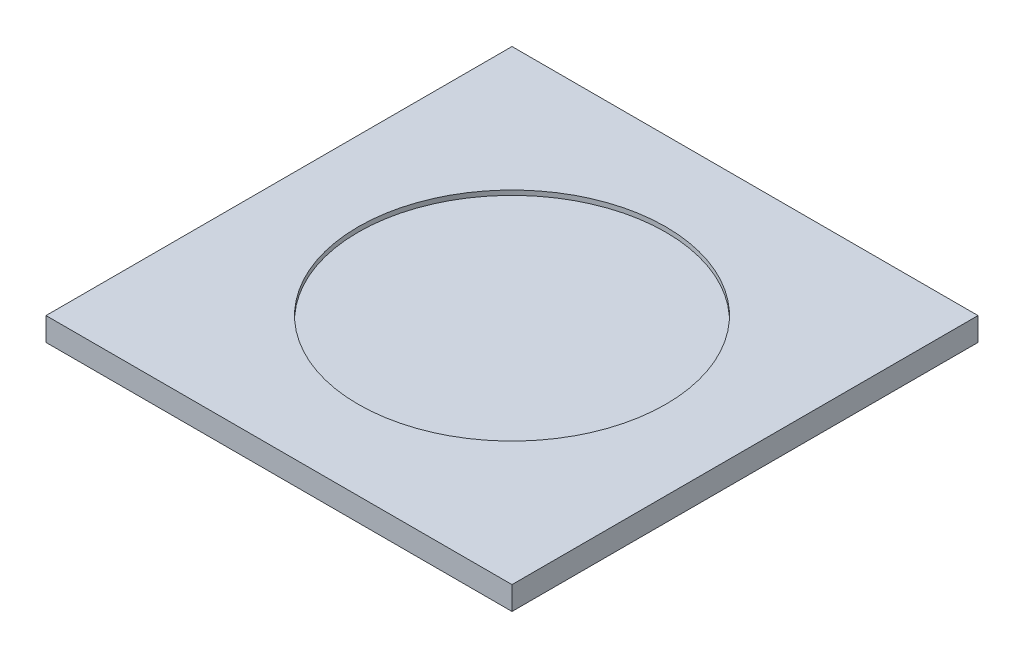
ISO-10303-21;
HEADER;
FILE_DESCRIPTION(('STEP AP214'),'2;1');
FILE_NAME('part.step','',(''),(''),'','','');
FILE_SCHEMA(('AUTOMOTIVE_DESIGN { 1 0 10303 214 1 1 1 1 }'));
ENDSEC;
DATA;
#1=APPLICATION_CONTEXT('core data for automotive mechanical design processes');
#2=APPLICATION_PROTOCOL_DEFINITION('international standard','automotive_design',2000,#1);
#3=PRODUCT_CONTEXT('',#1,'mechanical');
#4=PRODUCT('Part','Part','',(#3));
#5=PRODUCT_RELATED_PRODUCT_CATEGORY('part','',(#4));
#6=PRODUCT_DEFINITION_FORMATION('','',#4);
#7=PRODUCT_DEFINITION_CONTEXT('part definition',#1,'design');
#8=PRODUCT_DEFINITION('design','',#6,#7);
#9=PRODUCT_DEFINITION_SHAPE('','',#8);
#10=(LENGTH_UNIT() NAMED_UNIT(*) SI_UNIT(.MILLI.,.METRE.));
#11=(NAMED_UNIT(*) PLANE_ANGLE_UNIT() SI_UNIT($,.RADIAN.));
#12=(NAMED_UNIT(*) SI_UNIT($,.STERADIAN.) SOLID_ANGLE_UNIT());
#13=UNCERTAINTY_MEASURE_WITH_UNIT(LENGTH_MEASURE(1.E-05),#10,'distance_accuracy_value','');
#14=(GEOMETRIC_REPRESENTATION_CONTEXT(3) GLOBAL_UNCERTAINTY_ASSIGNED_CONTEXT((#13)) GLOBAL_UNIT_ASSIGNED_CONTEXT((#10,
#11,#12)) REPRESENTATION_CONTEXT('',''));
#15=CARTESIAN_POINT('',(0.,0.,0.));
#16=DIRECTION('',(0.,0.,1.));
#17=DIRECTION('',(1.,0.,0.));
#18=AXIS2_PLACEMENT_3D('',#15,#16,#17);
#19=CARTESIAN_POINT('',(1000.,100.,1000.));
#20=DIRECTION('',(-1.,0.,0.));
#21=DIRECTION('',(0.,0.,1.));
#22=AXIS2_PLACEMENT_3D('',#19,#20,#21);
#23=PLANE('',#22);
#24=DIRECTION('',(0.,0.,-1.));
#25=VECTOR('',#24,1.);
#26=CARTESIAN_POINT('',(1000.,0.,1000.));
#27=LINE('',#26,#25);
#28=CARTESIAN_POINT('',(1000.,0.,1000.));
#29=VERTEX_POINT('',#28);
#30=CARTESIAN_POINT('',(1000.,0.,-1000.));
#31=VERTEX_POINT('',#30);
#32=EDGE_CURVE('E107',#29,#31,#27,.T.);
#33=ORIENTED_EDGE('',*,*,#32,.T.);
#34=DIRECTION('',(0.,-1.,0.));
#35=VECTOR('',#34,1.);
#36=CARTESIAN_POINT('',(1000.,100.,-1000.));
#37=LINE('',#36,#35);
#38=CARTESIAN_POINT('',(1000.,100.,-1000.));
#39=VERTEX_POINT('',#38);
#40=EDGE_CURVE('E11',#39,#31,#37,.T.);
#41=ORIENTED_EDGE('',*,*,#40,.F.);
#42=DIRECTION('',(0.,0.,-1.));
#43=VECTOR('',#42,1.);
#44=CARTESIAN_POINT('',(1000.,100.,1000.));
#45=LINE('',#44,#43);
#46=CARTESIAN_POINT('',(1000.,100.,1000.));
#47=VERTEX_POINT('',#46);
#48=EDGE_CURVE('E91',#47,#39,#45,.T.);
#49=ORIENTED_EDGE('',*,*,#48,.F.);
#50=DIRECTION('',(0.,-1.,0.));
#51=VECTOR('',#50,1.);
#52=CARTESIAN_POINT('',(1000.,100.,1000.));
#53=LINE('',#52,#51);
#54=EDGE_CURVE('E103',#47,#29,#53,.T.);
#55=ORIENTED_EDGE('',*,*,#54,.T.);
#56=EDGE_LOOP('',(#33,#41,#49,#55));
#57=FACE_BOUND('',#56,.T.);
#58=ADVANCED_FACE('F39',(#57),#23,.F.);
#59=CARTESIAN_POINT('',(-1000.,100.,-1000.));
#60=DIRECTION('',(0.,0.,1.));
#61=DIRECTION('',(1.,0.,0.));
#62=AXIS2_PLACEMENT_3D('',#59,#60,#61);
#63=PLANE('',#62);
#64=DIRECTION('',(-1.,0.,0.));
#65=VECTOR('',#64,1.);
#66=CARTESIAN_POINT('',(-1000.,0.,-1000.));
#67=LINE('',#66,#65);
#68=CARTESIAN_POINT('',(-1000.,0.,-1000.));
#69=VERTEX_POINT('',#68);
#70=EDGE_CURVE('E96',#31,#69,#67,.T.);
#71=ORIENTED_EDGE('',*,*,#70,.T.);
#72=DIRECTION('',(0.,-1.,0.));
#73=VECTOR('',#72,1.);
#74=CARTESIAN_POINT('',(-1000.,100.,-1000.));
#75=LINE('',#74,#73);
#76=CARTESIAN_POINT('',(-1000.,100.,-1000.));
#77=VERTEX_POINT('',#76);
#78=EDGE_CURVE('E48',#77,#69,#75,.T.);
#79=ORIENTED_EDGE('',*,*,#78,.F.);
#80=DIRECTION('',(-1.,0.,0.));
#81=VECTOR('',#80,1.);
#82=CARTESIAN_POINT('',(-1000.,100.,-1000.));
#83=LINE('',#82,#81);
#84=EDGE_CURVE('E86',#39,#77,#83,.T.);
#85=ORIENTED_EDGE('',*,*,#84,.F.);
#86=ORIENTED_EDGE('',*,*,#40,.T.);
#87=EDGE_LOOP('',(#71,#79,#85,#86));
#88=FACE_BOUND('',#87,.T.);
#89=ADVANCED_FACE('F95',(#88),#63,.F.);
#90=CARTESIAN_POINT('',(-1000.,100.,1000.));
#91=DIRECTION('',(1.,0.,0.));
#92=DIRECTION('',(0.,0.,-1.));
#93=AXIS2_PLACEMENT_3D('',#90,#91,#92);
#94=PLANE('',#93);
#95=DIRECTION('',(0.,0.,1.));
#96=VECTOR('',#95,1.);
#97=CARTESIAN_POINT('',(-1000.,0.,1000.));
#98=LINE('',#97,#96);
#99=CARTESIAN_POINT('',(-1000.,0.,1000.));
#100=VERTEX_POINT('',#99);
#101=EDGE_CURVE('E73',#69,#100,#98,.T.);
#102=ORIENTED_EDGE('',*,*,#101,.T.);
#103=DIRECTION('',(0.,-1.,0.));
#104=VECTOR('',#103,1.);
#105=CARTESIAN_POINT('',(-1000.,100.,1000.));
#106=LINE('',#105,#104);
#107=CARTESIAN_POINT('',(-1000.,100.,1000.));
#108=VERTEX_POINT('',#107);
#109=EDGE_CURVE('E98',#108,#100,#106,.T.);
#110=ORIENTED_EDGE('',*,*,#109,.F.);
#111=DIRECTION('',(0.,0.,1.));
#112=VECTOR('',#111,1.);
#113=CARTESIAN_POINT('',(-1000.,100.,1000.));
#114=LINE('',#113,#112);
#115=EDGE_CURVE('E89',#77,#108,#114,.T.);
#116=ORIENTED_EDGE('',*,*,#115,.F.);
#117=ORIENTED_EDGE('',*,*,#78,.T.);
#118=EDGE_LOOP('',(#102,#110,#116,#117));
#119=FACE_BOUND('',#118,.T.);
#120=ADVANCED_FACE('F99',(#119),#94,.F.);
#121=CARTESIAN_POINT('',(-1000.,100.,1000.));
#122=DIRECTION('',(0.,0.,-1.));
#123=DIRECTION('',(-1.,0.,0.));
#124=AXIS2_PLACEMENT_3D('',#121,#122,#123);
#125=PLANE('',#124);
#126=DIRECTION('',(1.,0.,0.));
#127=VECTOR('',#126,1.);
#128=CARTESIAN_POINT('',(-1000.,0.,1000.));
#129=LINE('',#128,#127);
#130=EDGE_CURVE('E79',#100,#29,#129,.T.);
#131=ORIENTED_EDGE('',*,*,#130,.T.);
#132=ORIENTED_EDGE('',*,*,#54,.F.);
#133=DIRECTION('',(1.,0.,0.));
#134=VECTOR('',#133,1.);
#135=CARTESIAN_POINT('',(-1000.,100.,1000.));
#136=LINE('',#135,#134);
#137=EDGE_CURVE('E56',#108,#47,#136,.T.);
#138=ORIENTED_EDGE('',*,*,#137,.F.);
#139=ORIENTED_EDGE('',*,*,#109,.T.);
#140=EDGE_LOOP('',(#131,#132,#138,#139));
#141=FACE_BOUND('',#140,.T.);
#142=ADVANCED_FACE('F121',(#141),#125,.F.);
#143=CARTESIAN_POINT('',(0.,100.,0.));
#144=DIRECTION('',(0.,-1.,0.));
#145=DIRECTION('',(0.,0.,-1.));
#146=AXIS2_PLACEMENT_3D('',#143,#144,#145);
#147=PLANE('',#146);
#148=CARTESIAN_POINT('',(0.,100.,0.));
#149=DIRECTION('',(0.,1.,0.));
#150=DIRECTION('',(0.,0.,1.));
#151=AXIS2_PLACEMENT_3D('',#148,#149,#150);
#152=CIRCLE('',#151,660.);
#153=CARTESIAN_POINT('',(0.,100.,660.));
#154=VERTEX_POINT('',#153);
#155=EDGE_CURVE('E128',#154,#154,#152,.T.);
#156=ORIENTED_EDGE('',*,*,#155,.F.);
#157=EDGE_LOOP('',(#156));
#158=FACE_BOUND('',#157,.T.);
#159=ORIENTED_EDGE('',*,*,#48,.T.);
#160=ORIENTED_EDGE('',*,*,#84,.T.);
#161=ORIENTED_EDGE('',*,*,#115,.T.);
#162=ORIENTED_EDGE('',*,*,#137,.T.);
#163=EDGE_LOOP('',(#159,#160,#161,#162));
#164=FACE_BOUND('',#163,.T.);
#165=ADVANCED_FACE('F87',(#158,#164),#147,.F.);
#166=CARTESIAN_POINT('',(0.,0.,0.));
#167=DIRECTION('',(0.,-1.,0.));
#168=DIRECTION('',(0.,0.,-1.));
#169=AXIS2_PLACEMENT_3D('',#166,#167,#168);
#170=PLANE('',#169);
#171=ORIENTED_EDGE('',*,*,#32,.F.);
#172=ORIENTED_EDGE('',*,*,#130,.F.);
#173=ORIENTED_EDGE('',*,*,#101,.F.);
#174=ORIENTED_EDGE('',*,*,#70,.F.);
#175=EDGE_LOOP('',(#171,#172,#173,#174));
#176=FACE_BOUND('',#175,.T.);
#177=ADVANCED_FACE('F124',(#176),#170,.T.);
#178=CARTESIAN_POINT('',(0.,80.,0.));
#179=DIRECTION('',(0.,1.,0.));
#180=DIRECTION('',(0.,0.,1.));
#181=AXIS2_PLACEMENT_3D('',#178,#179,#180);
#182=CYLINDRICAL_SURFACE('',#181,660.);
#183=CARTESIAN_POINT('',(0.,80.,0.));
#184=DIRECTION('',(0.,1.,0.));
#185=DIRECTION('',(0.,0.,1.));
#186=AXIS2_PLACEMENT_3D('',#183,#184,#185);
#187=CIRCLE('',#186,660.);
#188=CARTESIAN_POINT('',(0.,80.,660.));
#189=VERTEX_POINT('',#188);
#190=EDGE_CURVE('E111',#189,#189,#187,.T.);
#191=ORIENTED_EDGE('',*,*,#190,.F.);
#192=EDGE_LOOP('',(#191));
#193=FACE_BOUND('',#192,.T.);
#194=ORIENTED_EDGE('',*,*,#155,.T.);
#195=EDGE_LOOP('',(#194));
#196=FACE_BOUND('',#195,.T.);
#197=ADVANCED_FACE('F138',(#193,#196),#182,.F.);
#198=CARTESIAN_POINT('',(0.,80.,0.));
#199=DIRECTION('',(0.,1.,0.));
#200=DIRECTION('',(0.,0.,1.));
#201=AXIS2_PLACEMENT_3D('',#198,#199,#200);
#202=PLANE('',#201);
#203=ORIENTED_EDGE('',*,*,#190,.T.);
#204=EDGE_LOOP('',(#203));
#205=FACE_BOUND('',#204,.T.);
#206=ADVANCED_FACE('F136',(#205),#202,.T.);
#207=CLOSED_SHELL('',(#58,#89,#120,#142,#165,#177,#197,#206));
#208=MANIFOLD_SOLID_BREP('B2',#207);
#209=ADVANCED_BREP_SHAPE_REPRESENTATION('',(#18,#208),#14);
#210=SHAPE_DEFINITION_REPRESENTATION(#9,#209);
ENDSEC;
END-ISO-10303-21;
